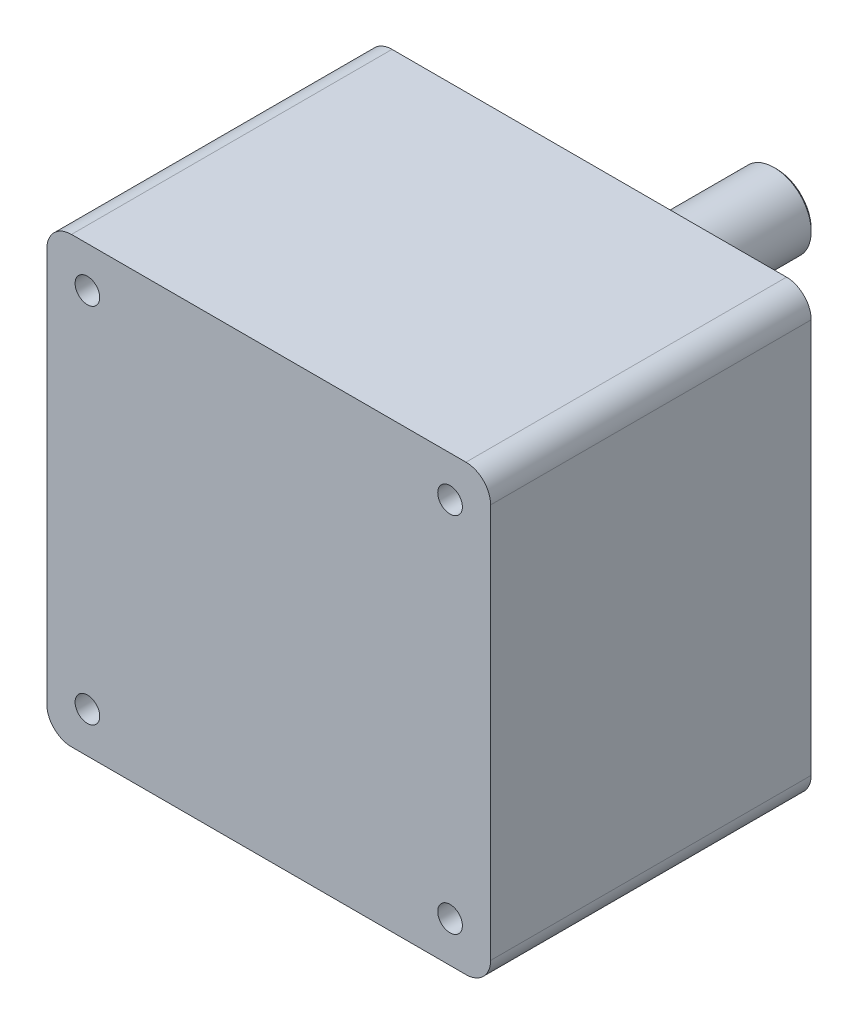
ISO-10303-21;
HEADER;
FILE_DESCRIPTION(('STEP AP214'),'2;1');
FILE_NAME('part.step','',(''),(''),'','','');
FILE_SCHEMA(('AUTOMOTIVE_DESIGN { 1 0 10303 214 1 1 1 1 }'));
ENDSEC;
DATA;
#1=APPLICATION_CONTEXT('core data for automotive mechanical design processes');
#2=APPLICATION_PROTOCOL_DEFINITION('international standard','automotive_design',2000,#1);
#3=PRODUCT_CONTEXT('',#1,'mechanical');
#4=PRODUCT('Part','Part','',(#3));
#5=PRODUCT_RELATED_PRODUCT_CATEGORY('part','',(#4));
#6=PRODUCT_DEFINITION_FORMATION('','',#4);
#7=PRODUCT_DEFINITION_CONTEXT('part definition',#1,'design');
#8=PRODUCT_DEFINITION('design','',#6,#7);
#9=PRODUCT_DEFINITION_SHAPE('','',#8);
#10=(LENGTH_UNIT() NAMED_UNIT(*) SI_UNIT(.MILLI.,.METRE.));
#11=(NAMED_UNIT(*) PLANE_ANGLE_UNIT() SI_UNIT($,.RADIAN.));
#12=(NAMED_UNIT(*) SI_UNIT($,.STERADIAN.) SOLID_ANGLE_UNIT());
#13=UNCERTAINTY_MEASURE_WITH_UNIT(LENGTH_MEASURE(1.E-05),#10,'distance_accuracy_value','');
#14=(GEOMETRIC_REPRESENTATION_CONTEXT(3) GLOBAL_UNCERTAINTY_ASSIGNED_CONTEXT((#13)) GLOBAL_UNIT_ASSIGNED_CONTEXT((#10,
#11,#12)) REPRESENTATION_CONTEXT('',''));
#15=CARTESIAN_POINT('',(0.,0.,0.));
#16=DIRECTION('',(0.,0.,1.));
#17=DIRECTION('',(1.,0.,0.));
#18=AXIS2_PLACEMENT_3D('',#15,#16,#17);
#19=CARTESIAN_POINT('',(0.,0.,-103.));
#20=DIRECTION('',(0.,0.,-1.));
#21=DIRECTION('',(0.,-1.,0.));
#22=AXIS2_PLACEMENT_3D('',#19,#20,#21);
#23=PLANE('',#22);
#24=CARTESIAN_POINT('',(0.,18.,-103.));
#25=DIRECTION('',(0.,0.,1.));
#26=DIRECTION('',(-1.,0.,0.));
#27=AXIS2_PLACEMENT_3D('',#24,#25,#26);
#28=CIRCLE('',#27,2.625);
#29=CARTESIAN_POINT('',(-2.625,18.,-103.));
#30=VERTEX_POINT('',#29);
#31=EDGE_CURVE('E170',#30,#30,#28,.T.);
#32=ORIENTED_EDGE('',*,*,#31,.T.);
#33=EDGE_LOOP('',(#32));
#34=FACE_BOUND('',#33,.T.);
#35=CARTESIAN_POINT('',(0.,18.,-103.000000000009));
#36=DIRECTION('',(0.,0.,1.));
#37=DIRECTION('',(1.,0.,0.));
#38=AXIS2_PLACEMENT_3D('',#35,#36,#37);
#39=CIRCLE('',#38,7.00000000000955);
#40=CARTESIAN_POINT('',(7.00000000000955,18.,-103.000000000009));
#41=VERTEX_POINT('',#40);
#42=EDGE_CURVE('E168',#41,#41,#39,.T.);
#43=ORIENTED_EDGE('',*,*,#42,.F.);
#44=EDGE_LOOP('',(#43));
#45=FACE_BOUND('',#44,.T.);
#46=ADVANCED_FACE('F16',(#34,#45),#23,.T.);
#47=CARTESIAN_POINT('',(0.,0.,-73.));
#48=DIRECTION('',(0.,0.,-1.));
#49=DIRECTION('',(0.,-1.,0.));
#50=AXIS2_PLACEMENT_3D('',#47,#48,#49);
#51=PLANE('',#50);
#52=CARTESIAN_POINT('',(0.,18.,-73.));
#53=DIRECTION('',(0.,0.,1.));
#54=DIRECTION('',(-1.,0.,0.));
#55=AXIS2_PLACEMENT_3D('',#52,#53,#54);
#56=CIRCLE('',#55,7.5);
#57=CARTESIAN_POINT('',(-7.5,18.,-73.));
#58=VERTEX_POINT('',#57);
#59=EDGE_CURVE('E183',#58,#58,#56,.T.);
#60=ORIENTED_EDGE('',*,*,#59,.T.);
#61=EDGE_LOOP('',(#60));
#62=FACE_BOUND('',#61,.T.);
#63=CARTESIAN_POINT('',(0.,18.,-73.));
#64=DIRECTION('',(0.,0.,1.));
#65=DIRECTION('',(-1.,0.,0.));
#66=AXIS2_PLACEMENT_3D('',#63,#64,#65);
#67=CIRCLE('',#66,18.);
#68=CARTESIAN_POINT('',(-18.,18.,-73.));
#69=VERTEX_POINT('',#68);
#70=EDGE_CURVE('E188',#69,#69,#67,.T.);
#71=ORIENTED_EDGE('',*,*,#70,.F.);
#72=EDGE_LOOP('',(#71));
#73=FACE_BOUND('',#72,.T.);
#74=ADVANCED_FACE('F160',(#62,#73),#51,.T.);
#75=CARTESIAN_POINT('',(0.,0.,-65.));
#76=DIRECTION('',(0.,0.,-1.));
#77=DIRECTION('',(0.,-1.,0.));
#78=AXIS2_PLACEMENT_3D('',#75,#76,#77);
#79=PLANE('',#78);
#80=CARTESIAN_POINT('',(-36.77,36.77,-65.));
#81=DIRECTION('',(0.,0.,1.));
#82=DIRECTION('',(-1.,0.,0.));
#83=AXIS2_PLACEMENT_3D('',#80,#81,#82);
#84=CIRCLE('',#83,2.5);
#85=CARTESIAN_POINT('',(-39.27,36.77,-65.));
#86=VERTEX_POINT('',#85);
#87=EDGE_CURVE('E227',#86,#86,#84,.T.);
#88=ORIENTED_EDGE('',*,*,#87,.T.);
#89=EDGE_LOOP('',(#88));
#90=FACE_BOUND('',#89,.T.);
#91=CARTESIAN_POINT('',(-36.77,-36.77,-65.));
#92=DIRECTION('',(0.,0.,1.));
#93=DIRECTION('',(1.,0.,0.));
#94=AXIS2_PLACEMENT_3D('',#91,#92,#93);
#95=CIRCLE('',#94,2.5);
#96=CARTESIAN_POINT('',(-34.27,-36.77,-65.));
#97=VERTEX_POINT('',#96);
#98=EDGE_CURVE('E208',#97,#97,#95,.T.);
#99=ORIENTED_EDGE('',*,*,#98,.T.);
#100=EDGE_LOOP('',(#99));
#101=FACE_BOUND('',#100,.T.);
#102=CARTESIAN_POINT('',(36.77,36.77,-65.));
#103=DIRECTION('',(0.,0.,1.));
#104=DIRECTION('',(1.,0.,0.));
#105=AXIS2_PLACEMENT_3D('',#102,#103,#104);
#106=CIRCLE('',#105,2.5);
#107=CARTESIAN_POINT('',(39.27,36.77,-65.));
#108=VERTEX_POINT('',#107);
#109=EDGE_CURVE('E207',#108,#108,#106,.T.);
#110=ORIENTED_EDGE('',*,*,#109,.T.);
#111=EDGE_LOOP('',(#110));
#112=FACE_BOUND('',#111,.T.);
#113=CARTESIAN_POINT('',(36.77,-36.77,-65.));
#114=DIRECTION('',(0.,0.,1.));
#115=DIRECTION('',(-1.,0.,0.));
#116=AXIS2_PLACEMENT_3D('',#113,#114,#115);
#117=CIRCLE('',#116,2.5);
#118=CARTESIAN_POINT('',(34.27,-36.77,-65.));
#119=VERTEX_POINT('',#118);
#120=EDGE_CURVE('E201',#119,#119,#117,.T.);
#121=ORIENTED_EDGE('',*,*,#120,.T.);
#122=EDGE_LOOP('',(#121));
#123=FACE_BOUND('',#122,.T.);
#124=CARTESIAN_POINT('',(0.,18.,-65.));
#125=DIRECTION('',(0.,0.,1.));
#126=DIRECTION('',(-1.,0.,0.));
#127=AXIS2_PLACEMENT_3D('',#124,#125,#126);
#128=CIRCLE('',#127,18.);
#129=CARTESIAN_POINT('',(-18.,18.,-65.));
#130=VERTEX_POINT('',#129);
#131=EDGE_CURVE('E190',#130,#130,#128,.T.);
#132=ORIENTED_EDGE('',*,*,#131,.T.);
#133=EDGE_LOOP('',(#132));
#134=FACE_BOUND('',#133,.T.);
#135=DIRECTION('',(0.,-1.,0.));
#136=VECTOR('',#135,1.);
#137=CARTESIAN_POINT('',(-45.,45.,-65.));
#138=LINE('',#137,#136);
#139=CARTESIAN_POINT('',(-45.,40.,-65.));
#140=VERTEX_POINT('',#139);
#141=CARTESIAN_POINT('',(-45.,-40.,-65.));
#142=VERTEX_POINT('',#141);
#143=EDGE_CURVE('E264',#140,#142,#138,.T.);
#144=ORIENTED_EDGE('',*,*,#143,.F.);
#145=CARTESIAN_POINT('',(-40.,40.,-65.));
#146=DIRECTION('',(0.,0.,1.));
#147=DIRECTION('',(1.,0.,0.));
#148=AXIS2_PLACEMENT_3D('',#145,#146,#147);
#149=CIRCLE('',#148,5.);
#150=CARTESIAN_POINT('',(-40.,45.,-65.));
#151=VERTEX_POINT('',#150);
#152=EDGE_CURVE('E290',#151,#140,#149,.T.);
#153=ORIENTED_EDGE('',*,*,#152,.F.);
#154=DIRECTION('',(-1.,0.,0.));
#155=VECTOR('',#154,1.);
#156=CARTESIAN_POINT('',(45.,45.,-65.));
#157=LINE('',#156,#155);
#158=CARTESIAN_POINT('',(40.,45.,-65.));
#159=VERTEX_POINT('',#158);
#160=EDGE_CURVE('E231',#159,#151,#157,.T.);
#161=ORIENTED_EDGE('',*,*,#160,.F.);
#162=CARTESIAN_POINT('',(40.,40.,-65.));
#163=DIRECTION('',(0.,0.,1.));
#164=DIRECTION('',(1.,0.,0.));
#165=AXIS2_PLACEMENT_3D('',#162,#163,#164);
#166=CIRCLE('',#165,5.);
#167=CARTESIAN_POINT('',(45.,40.,-65.));
#168=VERTEX_POINT('',#167);
#169=EDGE_CURVE('E240',#168,#159,#166,.T.);
#170=ORIENTED_EDGE('',*,*,#169,.F.);
#171=DIRECTION('',(0.,1.,0.));
#172=VECTOR('',#171,1.);
#173=CARTESIAN_POINT('',(45.,-45.,-65.));
#174=LINE('',#173,#172);
#175=CARTESIAN_POINT('',(45.,-40.,-65.));
#176=VERTEX_POINT('',#175);
#177=EDGE_CURVE('E11',#176,#168,#174,.T.);
#178=ORIENTED_EDGE('',*,*,#177,.F.);
#179=CARTESIAN_POINT('',(40.,-40.,-65.));
#180=DIRECTION('',(0.,0.,1.));
#181=DIRECTION('',(1.,0.,0.));
#182=AXIS2_PLACEMENT_3D('',#179,#180,#181);
#183=CIRCLE('',#182,5.);
#184=CARTESIAN_POINT('',(40.,-45.,-65.));
#185=VERTEX_POINT('',#184);
#186=EDGE_CURVE('E19',#185,#176,#183,.T.);
#187=ORIENTED_EDGE('',*,*,#186,.F.);
#188=DIRECTION('',(1.,0.,0.));
#189=VECTOR('',#188,1.);
#190=CARTESIAN_POINT('',(-45.,-45.,-65.));
#191=LINE('',#190,#189);
#192=CARTESIAN_POINT('',(-40.,-45.,-65.));
#193=VERTEX_POINT('',#192);
#194=EDGE_CURVE('E223',#193,#185,#191,.T.);
#195=ORIENTED_EDGE('',*,*,#194,.F.);
#196=CARTESIAN_POINT('',(-40.,-40.,-65.));
#197=DIRECTION('',(0.,0.,1.));
#198=DIRECTION('',(1.,0.,0.));
#199=AXIS2_PLACEMENT_3D('',#196,#197,#198);
#200=CIRCLE('',#199,5.);
#201=EDGE_CURVE('E222',#142,#193,#200,.T.);
#202=ORIENTED_EDGE('',*,*,#201,.F.);
#203=EDGE_LOOP('',(#144,#153,#161,#170,#178,#187,#195,#202));
#204=FACE_BOUND('',#203,.T.);
#205=ADVANCED_FACE('F165',(#90,#101,#112,#123,#134,#204),#79,.T.);
#206=CARTESIAN_POINT('',(45.,-45.,0.));
#207=DIRECTION('',(1.,0.,0.));
#208=DIRECTION('',(0.,1.,0.));
#209=AXIS2_PLACEMENT_3D('',#206,#207,#208);
#210=PLANE('',#209);
#211=ORIENTED_EDGE('',*,*,#177,.T.);
#212=DIRECTION('',(0.,0.,-1.));
#213=VECTOR('',#212,1.);
#214=CARTESIAN_POINT('',(45.,40.,-237.2708000271));
#215=LINE('',#214,#213);
#216=CARTESIAN_POINT('',(45.,40.,0.));
#217=VERTEX_POINT('',#216);
#218=EDGE_CURVE('E258',#217,#168,#215,.T.);
#219=ORIENTED_EDGE('',*,*,#218,.F.);
#220=DIRECTION('',(0.,-1.,0.));
#221=VECTOR('',#220,1.);
#222=CARTESIAN_POINT('',(45.,0.,0.));
#223=LINE('',#222,#221);
#224=CARTESIAN_POINT('',(45.,-40.,0.));
#225=VERTEX_POINT('',#224);
#226=EDGE_CURVE('E191',#217,#225,#223,.T.);
#227=ORIENTED_EDGE('',*,*,#226,.T.);
#228=DIRECTION('',(0.,0.,1.));
#229=VECTOR('',#228,1.);
#230=CARTESIAN_POINT('',(45.,-40.,-237.2708000271));
#231=LINE('',#230,#229);
#232=EDGE_CURVE('E293',#176,#225,#231,.T.);
#233=ORIENTED_EDGE('',*,*,#232,.F.);
#234=EDGE_LOOP('',(#211,#219,#227,#233));
#235=FACE_BOUND('',#234,.T.);
#236=ADVANCED_FACE('F355',(#235),#210,.T.);
#237=CARTESIAN_POINT('',(40.,-40.,-237.2708000271));
#238=DIRECTION('',(0.,0.,1.));
#239=DIRECTION('',(1.,0.,0.));
#240=AXIS2_PLACEMENT_3D('',#237,#238,#239);
#241=CYLINDRICAL_SURFACE('',#240,5.);
#242=ORIENTED_EDGE('',*,*,#232,.T.);
#243=CARTESIAN_POINT('',(40.,-40.,0.));
#244=DIRECTION('',(0.,0.,-1.));
#245=DIRECTION('',(1.,0.,0.));
#246=AXIS2_PLACEMENT_3D('',#243,#244,#245);
#247=CIRCLE('',#246,5.);
#248=CARTESIAN_POINT('',(40.,-45.,0.));
#249=VERTEX_POINT('',#248);
#250=EDGE_CURVE('E200',#225,#249,#247,.T.);
#251=ORIENTED_EDGE('',*,*,#250,.T.);
#252=DIRECTION('',(0.,0.,1.));
#253=VECTOR('',#252,1.);
#254=CARTESIAN_POINT('',(40.,-45.,0.));
#255=LINE('',#254,#253);
#256=EDGE_CURVE('E251',#185,#249,#255,.T.);
#257=ORIENTED_EDGE('',*,*,#256,.F.);
#258=ORIENTED_EDGE('',*,*,#186,.T.);
#259=EDGE_LOOP('',(#242,#251,#257,#258));
#260=FACE_BOUND('',#259,.T.);
#261=ADVANCED_FACE('F423',(#260),#241,.T.);
#262=CARTESIAN_POINT('',(-45.,-45.,0.));
#263=DIRECTION('',(0.,-1.,0.));
#264=DIRECTION('',(0.,0.,-1.));
#265=AXIS2_PLACEMENT_3D('',#262,#263,#264);
#266=PLANE('',#265);
#267=ORIENTED_EDGE('',*,*,#194,.T.);
#268=ORIENTED_EDGE('',*,*,#256,.T.);
#269=DIRECTION('',(-1.,0.,0.));
#270=VECTOR('',#269,1.);
#271=CARTESIAN_POINT('',(0.,-45.,0.));
#272=LINE('',#271,#270);
#273=CARTESIAN_POINT('',(-40.,-45.,0.));
#274=VERTEX_POINT('',#273);
#275=EDGE_CURVE('E236',#249,#274,#272,.T.);
#276=ORIENTED_EDGE('',*,*,#275,.T.);
#277=DIRECTION('',(0.,0.,1.));
#278=VECTOR('',#277,1.);
#279=CARTESIAN_POINT('',(-40.,-45.,-237.2708000271));
#280=LINE('',#279,#278);
#281=EDGE_CURVE('E226',#193,#274,#280,.T.);
#282=ORIENTED_EDGE('',*,*,#281,.F.);
#283=EDGE_LOOP('',(#267,#268,#276,#282));
#284=FACE_BOUND('',#283,.T.);
#285=ADVANCED_FACE('F417',(#284),#266,.T.);
#286=CARTESIAN_POINT('',(-40.,-40.,-237.2708000271));
#287=DIRECTION('',(0.,0.,1.));
#288=DIRECTION('',(1.,0.,0.));
#289=AXIS2_PLACEMENT_3D('',#286,#287,#288);
#290=CYLINDRICAL_SURFACE('',#289,5.);
#291=ORIENTED_EDGE('',*,*,#281,.T.);
#292=CARTESIAN_POINT('',(-40.,-40.,0.));
#293=DIRECTION('',(0.,0.,-1.));
#294=DIRECTION('',(1.,0.,0.));
#295=AXIS2_PLACEMENT_3D('',#292,#293,#294);
#296=CIRCLE('',#295,5.);
#297=CARTESIAN_POINT('',(-45.,-40.,0.));
#298=VERTEX_POINT('',#297);
#299=EDGE_CURVE('E239',#274,#298,#296,.T.);
#300=ORIENTED_EDGE('',*,*,#299,.T.);
#301=DIRECTION('',(0.,0.,1.));
#302=VECTOR('',#301,1.);
#303=CARTESIAN_POINT('',(-45.,-40.,0.));
#304=LINE('',#303,#302);
#305=EDGE_CURVE('E265',#142,#298,#304,.T.);
#306=ORIENTED_EDGE('',*,*,#305,.F.);
#307=ORIENTED_EDGE('',*,*,#201,.T.);
#308=EDGE_LOOP('',(#291,#300,#306,#307));
#309=FACE_BOUND('',#308,.T.);
#310=ADVANCED_FACE('F414',(#309),#290,.T.);
#311=CARTESIAN_POINT('',(-45.,45.,0.));
#312=DIRECTION('',(-1.,0.,0.));
#313=DIRECTION('',(0.,0.,1.));
#314=AXIS2_PLACEMENT_3D('',#311,#312,#313);
#315=PLANE('',#314);
#316=DIRECTION('',(0.,1.,0.));
#317=VECTOR('',#316,1.);
#318=CARTESIAN_POINT('',(-45.,0.,0.));
#319=LINE('',#318,#317);
#320=CARTESIAN_POINT('',(-45.,40.,0.));
#321=VERTEX_POINT('',#320);
#322=EDGE_CURVE('E245',#298,#321,#319,.T.);
#323=ORIENTED_EDGE('',*,*,#322,.T.);
#324=DIRECTION('',(0.,0.,1.));
#325=VECTOR('',#324,1.);
#326=CARTESIAN_POINT('',(-45.,40.,-237.2708000271));
#327=LINE('',#326,#325);
#328=EDGE_CURVE('E286',#140,#321,#327,.T.);
#329=ORIENTED_EDGE('',*,*,#328,.F.);
#330=ORIENTED_EDGE('',*,*,#143,.T.);
#331=ORIENTED_EDGE('',*,*,#305,.T.);
#332=EDGE_LOOP('',(#323,#329,#330,#331));
#333=FACE_BOUND('',#332,.T.);
#334=ADVANCED_FACE('F409',(#333),#315,.T.);
#335=CARTESIAN_POINT('',(-40.,40.,-237.2708000271));
#336=DIRECTION('',(0.,0.,1.));
#337=DIRECTION('',(1.,0.,0.));
#338=AXIS2_PLACEMENT_3D('',#335,#336,#337);
#339=CYLINDRICAL_SURFACE('',#338,5.);
#340=ORIENTED_EDGE('',*,*,#328,.T.);
#341=CARTESIAN_POINT('',(-40.,40.,0.));
#342=DIRECTION('',(0.,0.,-1.));
#343=DIRECTION('',(1.,0.,0.));
#344=AXIS2_PLACEMENT_3D('',#341,#342,#343);
#345=CIRCLE('',#344,5.);
#346=CARTESIAN_POINT('',(-40.,45.,0.));
#347=VERTEX_POINT('',#346);
#348=EDGE_CURVE('E247',#321,#347,#345,.T.);
#349=ORIENTED_EDGE('',*,*,#348,.T.);
#350=DIRECTION('',(0.,0.,1.));
#351=VECTOR('',#350,1.);
#352=CARTESIAN_POINT('',(-40.,45.,0.));
#353=LINE('',#352,#351);
#354=EDGE_CURVE('E234',#151,#347,#353,.T.);
#355=ORIENTED_EDGE('',*,*,#354,.F.);
#356=ORIENTED_EDGE('',*,*,#152,.T.);
#357=EDGE_LOOP('',(#340,#349,#355,#356));
#358=FACE_BOUND('',#357,.T.);
#359=ADVANCED_FACE('F407',(#358),#339,.T.);
#360=CARTESIAN_POINT('',(45.,45.,0.));
#361=DIRECTION('',(0.,1.,0.));
#362=DIRECTION('',(1.,0.,0.));
#363=AXIS2_PLACEMENT_3D('',#360,#361,#362);
#364=PLANE('',#363);
#365=ORIENTED_EDGE('',*,*,#160,.T.);
#366=ORIENTED_EDGE('',*,*,#354,.T.);
#367=DIRECTION('',(1.,0.,0.));
#368=VECTOR('',#367,1.);
#369=CARTESIAN_POINT('',(0.,45.,0.));
#370=LINE('',#369,#368);
#371=CARTESIAN_POINT('',(40.,45.,0.));
#372=VERTEX_POINT('',#371);
#373=EDGE_CURVE('E256',#347,#372,#370,.T.);
#374=ORIENTED_EDGE('',*,*,#373,.T.);
#375=DIRECTION('',(0.,0.,1.));
#376=VECTOR('',#375,1.);
#377=CARTESIAN_POINT('',(40.,45.,-237.2708000271));
#378=LINE('',#377,#376);
#379=EDGE_CURVE('E255',#159,#372,#378,.T.);
#380=ORIENTED_EDGE('',*,*,#379,.F.);
#381=EDGE_LOOP('',(#365,#366,#374,#380));
#382=FACE_BOUND('',#381,.T.);
#383=ADVANCED_FACE('F402',(#382),#364,.T.);
#384=CARTESIAN_POINT('',(40.,40.,-237.2708000271));
#385=DIRECTION('',(0.,0.,1.));
#386=DIRECTION('',(1.,0.,0.));
#387=AXIS2_PLACEMENT_3D('',#384,#385,#386);
#388=CYLINDRICAL_SURFACE('',#387,5.);
#389=ORIENTED_EDGE('',*,*,#379,.T.);
#390=CARTESIAN_POINT('',(40.,40.,0.));
#391=DIRECTION('',(0.,0.,-1.));
#392=DIRECTION('',(1.,0.,0.));
#393=AXIS2_PLACEMENT_3D('',#390,#391,#392);
#394=CIRCLE('',#393,5.);
#395=EDGE_CURVE('E196',#372,#217,#394,.T.);
#396=ORIENTED_EDGE('',*,*,#395,.T.);
#397=ORIENTED_EDGE('',*,*,#218,.T.);
#398=ORIENTED_EDGE('',*,*,#169,.T.);
#399=EDGE_LOOP('',(#389,#396,#397,#398));
#400=FACE_BOUND('',#399,.T.);
#401=ADVANCED_FACE('F400',(#400),#388,.T.);
#402=CARTESIAN_POINT('',(0.,0.,0.));
#403=DIRECTION('',(0.,0.,-1.));
#404=DIRECTION('',(0.,-1.,0.));
#405=AXIS2_PLACEMENT_3D('',#402,#403,#404);
#406=PLANE('',#405);
#407=CARTESIAN_POINT('',(-36.77,36.77,0.));
#408=DIRECTION('',(0.,0.,1.));
#409=DIRECTION('',(1.,0.,0.));
#410=AXIS2_PLACEMENT_3D('',#407,#408,#409);
#411=CIRCLE('',#410,2.5);
#412=CARTESIAN_POINT('',(-34.27,36.77,0.));
#413=VERTEX_POINT('',#412);
#414=EDGE_CURVE('E321',#413,#413,#411,.T.);
#415=ORIENTED_EDGE('',*,*,#414,.F.);
#416=EDGE_LOOP('',(#415));
#417=FACE_BOUND('',#416,.T.);
#418=CARTESIAN_POINT('',(36.77,36.77,0.));
#419=DIRECTION('',(0.,0.,1.));
#420=DIRECTION('',(-1.,0.,0.));
#421=AXIS2_PLACEMENT_3D('',#418,#419,#420);
#422=CIRCLE('',#421,2.5);
#423=CARTESIAN_POINT('',(34.27,36.77,0.));
#424=VERTEX_POINT('',#423);
#425=EDGE_CURVE('E318',#424,#424,#422,.T.);
#426=ORIENTED_EDGE('',*,*,#425,.F.);
#427=EDGE_LOOP('',(#426));
#428=FACE_BOUND('',#427,.T.);
#429=CARTESIAN_POINT('',(-36.77,-36.77,0.));
#430=DIRECTION('',(0.,0.,1.));
#431=DIRECTION('',(-1.,0.,0.));
#432=AXIS2_PLACEMENT_3D('',#429,#430,#431);
#433=CIRCLE('',#432,2.5);
#434=CARTESIAN_POINT('',(-39.27,-36.77,0.));
#435=VERTEX_POINT('',#434);
#436=EDGE_CURVE('E455',#435,#435,#433,.T.);
#437=ORIENTED_EDGE('',*,*,#436,.F.);
#438=EDGE_LOOP('',(#437));
#439=FACE_BOUND('',#438,.T.);
#440=CARTESIAN_POINT('',(36.77,-36.77,0.));
#441=DIRECTION('',(0.,0.,1.));
#442=DIRECTION('',(1.,0.,0.));
#443=AXIS2_PLACEMENT_3D('',#440,#441,#442);
#444=CIRCLE('',#443,2.5);
#445=CARTESIAN_POINT('',(39.27,-36.77,0.));
#446=VERTEX_POINT('',#445);
#447=EDGE_CURVE('E454',#446,#446,#444,.T.);
#448=ORIENTED_EDGE('',*,*,#447,.F.);
#449=EDGE_LOOP('',(#448));
#450=FACE_BOUND('',#449,.T.);
#451=ORIENTED_EDGE('',*,*,#373,.F.);
#452=ORIENTED_EDGE('',*,*,#348,.F.);
#453=ORIENTED_EDGE('',*,*,#322,.F.);
#454=ORIENTED_EDGE('',*,*,#299,.F.);
#455=ORIENTED_EDGE('',*,*,#275,.F.);
#456=ORIENTED_EDGE('',*,*,#250,.F.);
#457=ORIENTED_EDGE('',*,*,#226,.F.);
#458=ORIENTED_EDGE('',*,*,#395,.F.);
#459=EDGE_LOOP('',(#451,#452,#453,#454,#455,#456,#457,#458));
#460=FACE_BOUND('',#459,.T.);
#461=ADVANCED_FACE('F389',(#417,#428,#439,#450,#460),#406,.F.);
#462=CARTESIAN_POINT('',(0.,18.,-87.2499999999263));
#463=DIRECTION('',(0.,0.,-1.));
#464=DIRECTION('',(-1.,0.,0.));
#465=AXIS2_PLACEMENT_3D('',#462,#463,#464);
#466=CONICAL_SURFACE('',#465,2.62499999990951,1.02974425858066);
#467=CARTESIAN_POINT('',(0.,18.,-87.25));
#468=DIRECTION('',(0.,0.,-1.));
#469=DIRECTION('',(-1.,0.,0.));
#470=AXIS2_PLACEMENT_3D('',#467,#468,#469);
#471=CIRCLE('',#470,2.625);
#472=CARTESIAN_POINT('',(-2.625,18.,-87.25));
#473=VERTEX_POINT('',#472);
#474=EDGE_CURVE('E174',#473,#473,#471,.T.);
#475=ORIENTED_EDGE('',*,*,#474,.T.);
#476=EDGE_LOOP('',(#475));
#477=FACE_BOUND('',#476,.T.);
#478=CARTESIAN_POINT('',(-1.98951966012828E-10,18.,-85.6727408748839));
#479=VERTEX_POINT('',#478);
#480=VERTEX_LOOP('',#479);
#481=FACE_BOUND('',#480,.T.);
#482=ADVANCED_FACE('F377',(#477,#481),#466,.F.);
#483=CARTESIAN_POINT('',(0.,18.,-84.80637791881));
#484=DIRECTION('',(0.,0.,-1.));
#485=DIRECTION('',(-1.,0.,0.));
#486=AXIS2_PLACEMENT_3D('',#483,#484,#485);
#487=CYLINDRICAL_SURFACE('',#486,2.625);
#488=ORIENTED_EDGE('',*,*,#31,.F.);
#489=EDGE_LOOP('',(#488));
#490=FACE_BOUND('',#489,.T.);
#491=ORIENTED_EDGE('',*,*,#474,.F.);
#492=EDGE_LOOP('',(#491));
#493=FACE_BOUND('',#492,.T.);
#494=ADVANCED_FACE('F376',(#490,#493),#487,.F.);
#495=CARTESIAN_POINT('',(0.,18.,-102.5));
#496=DIRECTION('',(0.,0.,1.));
#497=DIRECTION('',(1.,0.,0.));
#498=AXIS2_PLACEMENT_3D('',#495,#496,#497);
#499=CONICAL_SURFACE('',#498,7.50000000001891,0.785398163397296);
#500=CARTESIAN_POINT('',(0.,18.,-102.5));
#501=DIRECTION('',(0.,0.,1.));
#502=DIRECTION('',(-1.,0.,0.));
#503=AXIS2_PLACEMENT_3D('',#500,#501,#502);
#504=CIRCLE('',#503,7.5);
#505=CARTESIAN_POINT('',(-7.5,18.,-102.5));
#506=VERTEX_POINT('',#505);
#507=EDGE_CURVE('E173',#506,#506,#504,.T.);
#508=ORIENTED_EDGE('',*,*,#507,.F.);
#509=EDGE_LOOP('',(#508));
#510=FACE_BOUND('',#509,.T.);
#511=ORIENTED_EDGE('',*,*,#42,.T.);
#512=EDGE_LOOP('',(#511));
#513=FACE_BOUND('',#512,.T.);
#514=ADVANCED_FACE('F378',(#510,#513),#499,.T.);
#515=CARTESIAN_POINT('',(0.,18.,-73.));
#516=DIRECTION('',(0.,0.,-1.));
#517=DIRECTION('',(-1.,0.,0.));
#518=AXIS2_PLACEMENT_3D('',#515,#516,#517);
#519=CYLINDRICAL_SURFACE('',#518,7.5);
#520=ORIENTED_EDGE('',*,*,#507,.T.);
#521=EDGE_LOOP('',(#520));
#522=FACE_BOUND('',#521,.T.);
#523=ORIENTED_EDGE('',*,*,#59,.F.);
#524=EDGE_LOOP('',(#523));
#525=FACE_BOUND('',#524,.T.);
#526=ADVANCED_FACE('F384',(#522,#525),#519,.T.);
#527=CARTESIAN_POINT('',(-36.77,36.77,-49.9999999998977));
#528=DIRECTION('',(0.,0.,-1.));
#529=DIRECTION('',(0.,1.,0.));
#530=AXIS2_PLACEMENT_3D('',#527,#528,#529);
#531=CONICAL_SURFACE('',#530,2.49999999983722,1.02974425854165);
#532=CARTESIAN_POINT('',(-36.77,36.77,-50.));
#533=DIRECTION('',(0.,0.,-1.));
#534=DIRECTION('',(-1.,0.,0.));
#535=AXIS2_PLACEMENT_3D('',#532,#533,#534);
#536=CIRCLE('',#535,2.5);
#537=CARTESIAN_POINT('',(-39.27,36.77,-50.));
#538=VERTEX_POINT('',#537);
#539=EDGE_CURVE('E219',#538,#538,#536,.T.);
#540=ORIENTED_EDGE('',*,*,#539,.T.);
#541=EDGE_LOOP('',(#540));
#542=FACE_BOUND('',#541,.T.);
#543=CARTESIAN_POINT('',(-36.7699999999716,36.77,-48.4978484523424));
#544=VERTEX_POINT('',#543);
#545=VERTEX_LOOP('',#544);
#546=FACE_BOUND('',#545,.T.);
#547=ADVANCED_FACE('F711',(#542,#546),#531,.F.);
#548=CARTESIAN_POINT('',(-36.77,-36.77,-50.0000000000114));
#549=DIRECTION('',(0.,0.,-1.));
#550=DIRECTION('',(0.,1.,0.));
#551=AXIS2_PLACEMENT_3D('',#548,#549,#550);
#552=CONICAL_SURFACE('',#551,2.49999999993086,1.02974425867503);
#553=CARTESIAN_POINT('',(-36.77,-36.77,-50.));
#554=DIRECTION('',(0.,0.,-1.));
#555=DIRECTION('',(1.,0.,0.));
#556=AXIS2_PLACEMENT_3D('',#553,#554,#555);
#557=CIRCLE('',#556,2.5);
#558=CARTESIAN_POINT('',(-34.27,-36.77,-50.));
#559=VERTEX_POINT('',#558);
#560=EDGE_CURVE('E216',#559,#559,#557,.T.);
#561=ORIENTED_EDGE('',*,*,#560,.T.);
#562=EDGE_LOOP('',(#561));
#563=FACE_BOUND('',#562,.T.);
#564=CARTESIAN_POINT('',(-36.77,-36.77,-48.4978484524845));
#565=VERTEX_POINT('',#564);
#566=VERTEX_LOOP('',#565);
#567=FACE_BOUND('',#566,.T.);
#568=ADVANCED_FACE('F375',(#563,#567),#552,.F.);
#569=CARTESIAN_POINT('',(36.77,36.77,-49.9999999999545));
#570=DIRECTION('',(0.,0.,-1.));
#571=DIRECTION('',(-1.,0.,0.));
#572=AXIS2_PLACEMENT_3D('',#569,#570,#571);
#573=CONICAL_SURFACE('',#572,2.49999999978038,1.02974425854165);
#574=CARTESIAN_POINT('',(36.77,36.77,-50.));
#575=DIRECTION('',(0.,0.,-1.));
#576=DIRECTION('',(1.,0.,0.));
#577=AXIS2_PLACEMENT_3D('',#574,#575,#576);
#578=CIRCLE('',#577,2.5);
#579=CARTESIAN_POINT('',(39.27,36.77,-50.));
#580=VERTEX_POINT('',#579);
#581=EDGE_CURVE('E204',#580,#580,#578,.T.);
#582=ORIENTED_EDGE('',*,*,#581,.T.);
#583=EDGE_LOOP('',(#582));
#584=FACE_BOUND('',#583,.T.);
#585=CARTESIAN_POINT('',(36.77,36.7700000000853,-48.497848452314));
#586=VERTEX_POINT('',#585);
#587=VERTEX_LOOP('',#586);
#588=FACE_BOUND('',#587,.T.);
#589=ADVANCED_FACE('F366',(#584,#588),#573,.F.);
#590=CARTESIAN_POINT('',(36.77,-36.77,-49.9999999998977));
#591=DIRECTION('',(0.,0.,-1.));
#592=DIRECTION('',(0.,1.,0.));
#593=AXIS2_PLACEMENT_3D('',#590,#591,#592);
#594=CONICAL_SURFACE('',#593,2.49999999981717,1.02974425853457);
#595=CARTESIAN_POINT('',(36.77,-36.77,-50.));
#596=DIRECTION('',(0.,0.,-1.));
#597=DIRECTION('',(-1.,0.,0.));
#598=AXIS2_PLACEMENT_3D('',#595,#596,#597);
#599=CIRCLE('',#598,2.5);
#600=CARTESIAN_POINT('',(34.27,-36.77,-50.));
#601=VERTEX_POINT('',#600);
#602=EDGE_CURVE('E194',#601,#601,#599,.T.);
#603=ORIENTED_EDGE('',*,*,#602,.T.);
#604=EDGE_LOOP('',(#603));
#605=FACE_BOUND('',#604,.T.);
#606=CARTESIAN_POINT('',(36.7700000001137,-36.77,-48.4978484523708));
#607=VERTEX_POINT('',#606);
#608=VERTEX_LOOP('',#607);
#609=FACE_BOUND('',#608,.T.);
#610=ADVANCED_FACE('F371',(#605,#609),#594,.F.);
#611=CARTESIAN_POINT('',(-36.77,36.77,-47.67274087505));
#612=DIRECTION('',(0.,0.,-1.));
#613=DIRECTION('',(-1.,0.,0.));
#614=AXIS2_PLACEMENT_3D('',#611,#612,#613);
#615=CYLINDRICAL_SURFACE('',#614,2.5);
#616=ORIENTED_EDGE('',*,*,#87,.F.);
#617=EDGE_LOOP('',(#616));
#618=FACE_BOUND('',#617,.T.);
#619=ORIENTED_EDGE('',*,*,#539,.F.);
#620=EDGE_LOOP('',(#619));
#621=FACE_BOUND('',#620,.T.);
#622=ADVANCED_FACE('F343',(#618,#621),#615,.F.);
#623=CARTESIAN_POINT('',(-36.77,-36.77,-47.67274087505));
#624=DIRECTION('',(0.,0.,1.));
#625=DIRECTION('',(1.,0.,0.));
#626=AXIS2_PLACEMENT_3D('',#623,#624,#625);
#627=CYLINDRICAL_SURFACE('',#626,2.5);
#628=ORIENTED_EDGE('',*,*,#560,.F.);
#629=EDGE_LOOP('',(#628));
#630=FACE_BOUND('',#629,.T.);
#631=ORIENTED_EDGE('',*,*,#98,.F.);
#632=EDGE_LOOP('',(#631));
#633=FACE_BOUND('',#632,.T.);
#634=ADVANCED_FACE('F331',(#630,#633),#627,.F.);
#635=CARTESIAN_POINT('',(36.77,36.77,-47.67274087505));
#636=DIRECTION('',(0.,0.,1.));
#637=DIRECTION('',(1.,0.,0.));
#638=AXIS2_PLACEMENT_3D('',#635,#636,#637);
#639=CYLINDRICAL_SURFACE('',#638,2.5);
#640=ORIENTED_EDGE('',*,*,#581,.F.);
#641=EDGE_LOOP('',(#640));
#642=FACE_BOUND('',#641,.T.);
#643=ORIENTED_EDGE('',*,*,#109,.F.);
#644=EDGE_LOOP('',(#643));
#645=FACE_BOUND('',#644,.T.);
#646=ADVANCED_FACE('F335',(#642,#645),#639,.F.);
#647=CARTESIAN_POINT('',(36.77,-36.77,-47.67274087505));
#648=DIRECTION('',(0.,0.,-1.));
#649=DIRECTION('',(-1.,0.,0.));
#650=AXIS2_PLACEMENT_3D('',#647,#648,#649);
#651=CYLINDRICAL_SURFACE('',#650,2.5);
#652=ORIENTED_EDGE('',*,*,#120,.F.);
#653=EDGE_LOOP('',(#652));
#654=FACE_BOUND('',#653,.T.);
#655=ORIENTED_EDGE('',*,*,#602,.F.);
#656=EDGE_LOOP('',(#655));
#657=FACE_BOUND('',#656,.T.);
#658=ADVANCED_FACE('F147',(#654,#657),#651,.F.);
#659=CARTESIAN_POINT('',(0.,18.,-65.));
#660=DIRECTION('',(0.,0.,-1.));
#661=DIRECTION('',(-1.,0.,0.));
#662=AXIS2_PLACEMENT_3D('',#659,#660,#661);
#663=CYLINDRICAL_SURFACE('',#662,18.);
#664=ORIENTED_EDGE('',*,*,#70,.T.);
#665=EDGE_LOOP('',(#664));
#666=FACE_BOUND('',#665,.T.);
#667=ORIENTED_EDGE('',*,*,#131,.F.);
#668=EDGE_LOOP('',(#667));
#669=FACE_BOUND('',#668,.T.);
#670=ADVANCED_FACE('F136',(#666,#669),#663,.T.);
#671=CARTESIAN_POINT('',(-36.77,36.77,-14.9999999999864));
#672=DIRECTION('',(0.,0.,1.));
#673=DIRECTION('',(1.,0.,0.));
#674=AXIS2_PLACEMENT_3D('',#671,#672,#673);
#675=CONICAL_SURFACE('',#674,2.49999999993086,1.02974425857479);
#676=CARTESIAN_POINT('',(-36.77,36.77,-15.));
#677=DIRECTION('',(0.,0.,1.));
#678=DIRECTION('',(1.,0.,0.));
#679=AXIS2_PLACEMENT_3D('',#676,#677,#678);
#680=CIRCLE('',#679,2.5);
#681=CARTESIAN_POINT('',(-34.27,36.77,-15.));
#682=VERTEX_POINT('',#681);
#683=EDGE_CURVE('E320',#682,#682,#680,.T.);
#684=ORIENTED_EDGE('',*,*,#683,.T.);
#685=EDGE_LOOP('',(#684));
#686=FACE_BOUND('',#685,.T.);
#687=CARTESIAN_POINT('',(-36.77,36.77,-16.5021515478543));
#688=VERTEX_POINT('',#687);
#689=VERTEX_LOOP('',#688);
#690=FACE_BOUND('',#689,.T.);
#691=ADVANCED_FACE('F137',(#686,#690),#675,.F.);
#692=CARTESIAN_POINT('',(36.77,36.77,-15.0000000000432));
#693=DIRECTION('',(0.,0.,1.));
#694=DIRECTION('',(1.,0.,0.));
#695=AXIS2_PLACEMENT_3D('',#692,#693,#694);
#696=CONICAL_SURFACE('',#695,2.49999999995091,1.02974425852839);
#697=CARTESIAN_POINT('',(36.77,36.77,-15.));
#698=DIRECTION('',(0.,0.,1.));
#699=DIRECTION('',(-1.,0.,0.));
#700=AXIS2_PLACEMENT_3D('',#697,#698,#699);
#701=CIRCLE('',#700,2.5);
#702=CARTESIAN_POINT('',(34.27,36.77,-15.));
#703=VERTEX_POINT('',#702);
#704=EDGE_CURVE('E311',#703,#703,#701,.T.);
#705=ORIENTED_EDGE('',*,*,#704,.T.);
#706=EDGE_LOOP('',(#705));
#707=FACE_BOUND('',#706,.T.);
#708=CARTESIAN_POINT('',(36.77,36.77,-16.5021515480248));
#709=VERTEX_POINT('',#708);
#710=VERTEX_LOOP('',#709);
#711=FACE_BOUND('',#710,.T.);
#712=ADVANCED_FACE('F139',(#707,#711),#696,.F.);
#713=CARTESIAN_POINT('',(-36.77,-36.77,-14.9999999999864));
#714=DIRECTION('',(0.,0.,1.));
#715=DIRECTION('',(1.,0.,0.));
#716=AXIS2_PLACEMENT_3D('',#713,#714,#715);
#717=CONICAL_SURFACE('',#716,2.49999999993086,1.02974425853134);
#718=CARTESIAN_POINT('',(-36.77,-36.77,-15.));
#719=DIRECTION('',(0.,0.,1.));
#720=DIRECTION('',(-1.,0.,0.));
#721=AXIS2_PLACEMENT_3D('',#718,#719,#720);
#722=CIRCLE('',#721,2.5);
#723=CARTESIAN_POINT('',(-39.27,-36.77,-15.));
#724=VERTEX_POINT('',#723);
#725=EDGE_CURVE('E310',#724,#724,#722,.T.);
#726=ORIENTED_EDGE('',*,*,#725,.T.);
#727=EDGE_LOOP('',(#726));
#728=FACE_BOUND('',#727,.T.);
#729=CARTESIAN_POINT('',(-36.77,-36.77,-16.5021515479679));
#730=VERTEX_POINT('',#729);
#731=VERTEX_LOOP('',#730);
#732=FACE_BOUND('',#731,.T.);
#733=ADVANCED_FACE('F150',(#728,#732),#717,.F.);
#734=CARTESIAN_POINT('',(36.77,-36.77,-15.0000000000432));
#735=DIRECTION('',(0.,0.,1.));
#736=DIRECTION('',(1.,0.,0.));
#737=AXIS2_PLACEMENT_3D('',#734,#735,#736);
#738=CONICAL_SURFACE('',#737,2.49999999989407,1.02974425858163);
#739=CARTESIAN_POINT('',(36.77,-36.77,-15.));
#740=DIRECTION('',(0.,0.,1.));
#741=DIRECTION('',(1.,0.,0.));
#742=AXIS2_PLACEMENT_3D('',#739,#740,#741);
#743=CIRCLE('',#742,2.5);
#744=CARTESIAN_POINT('',(39.27,-36.77,-15.));
#745=VERTEX_POINT('',#744);
#746=EDGE_CURVE('E450',#745,#745,#743,.T.);
#747=ORIENTED_EDGE('',*,*,#746,.T.);
#748=EDGE_LOOP('',(#747));
#749=FACE_BOUND('',#748,.T.);
#750=CARTESIAN_POINT('',(36.77,-36.77,-16.5021515478543));
#751=VERTEX_POINT('',#750);
#752=VERTEX_LOOP('',#751);
#753=FACE_BOUND('',#752,.T.);
#754=ADVANCED_FACE('F361',(#749,#753),#738,.F.);
#755=CARTESIAN_POINT('',(-36.77,36.77,-17.32725912495));
#756=DIRECTION('',(0.,0.,1.));
#757=DIRECTION('',(1.,0.,0.));
#758=AXIS2_PLACEMENT_3D('',#755,#756,#757);
#759=CYLINDRICAL_SURFACE('',#758,2.5);
#760=ORIENTED_EDGE('',*,*,#414,.T.);
#761=EDGE_LOOP('',(#760));
#762=FACE_BOUND('',#761,.T.);
#763=ORIENTED_EDGE('',*,*,#683,.F.);
#764=EDGE_LOOP('',(#763));
#765=FACE_BOUND('',#764,.T.);
#766=ADVANCED_FACE('F356',(#762,#765),#759,.F.);
#767=CARTESIAN_POINT('',(36.77,36.77,-17.32725912495));
#768=DIRECTION('',(0.,0.,-1.));
#769=DIRECTION('',(-1.,0.,0.));
#770=AXIS2_PLACEMENT_3D('',#767,#768,#769);
#771=CYLINDRICAL_SURFACE('',#770,2.5);
#772=ORIENTED_EDGE('',*,*,#704,.F.);
#773=EDGE_LOOP('',(#772));
#774=FACE_BOUND('',#773,.T.);
#775=ORIENTED_EDGE('',*,*,#425,.T.);
#776=EDGE_LOOP('',(#775));
#777=FACE_BOUND('',#776,.T.);
#778=ADVANCED_FACE('F354',(#774,#777),#771,.F.);
#779=CARTESIAN_POINT('',(-36.77,-36.77,-17.32725912495));
#780=DIRECTION('',(0.,0.,-1.));
#781=DIRECTION('',(-1.,0.,0.));
#782=AXIS2_PLACEMENT_3D('',#779,#780,#781);
#783=CYLINDRICAL_SURFACE('',#782,2.5);
#784=ORIENTED_EDGE('',*,*,#725,.F.);
#785=EDGE_LOOP('',(#784));
#786=FACE_BOUND('',#785,.T.);
#787=ORIENTED_EDGE('',*,*,#436,.T.);
#788=EDGE_LOOP('',(#787));
#789=FACE_BOUND('',#788,.T.);
#790=ADVANCED_FACE('F359',(#786,#789),#783,.F.);
#791=CARTESIAN_POINT('',(36.77,-36.77,-17.32725912495));
#792=DIRECTION('',(0.,0.,1.));
#793=DIRECTION('',(1.,0.,0.));
#794=AXIS2_PLACEMENT_3D('',#791,#792,#793);
#795=CYLINDRICAL_SURFACE('',#794,2.5);
#796=ORIENTED_EDGE('',*,*,#447,.T.);
#797=EDGE_LOOP('',(#796));
#798=FACE_BOUND('',#797,.T.);
#799=ORIENTED_EDGE('',*,*,#746,.F.);
#800=EDGE_LOOP('',(#799));
#801=FACE_BOUND('',#800,.T.);
#802=ADVANCED_FACE('F347',(#798,#801),#795,.F.);
#803=CLOSED_SHELL('',(#46,#74,#205,#236,#261,#285,#310,#334,#359,#383,#401,#461,#482,#494,#514,
#526,#547,#568,#589,#610,#622,#634,#646,#658,#670,#691,#712,#733,#754,#766,#778,#790,#802));
#804=MANIFOLD_SOLID_BREP('B1',#803);
#805=ADVANCED_BREP_SHAPE_REPRESENTATION('',(#18,#804),#14);
#806=SHAPE_DEFINITION_REPRESENTATION(#9,#805);
ENDSEC;
END-ISO-10303-21;
